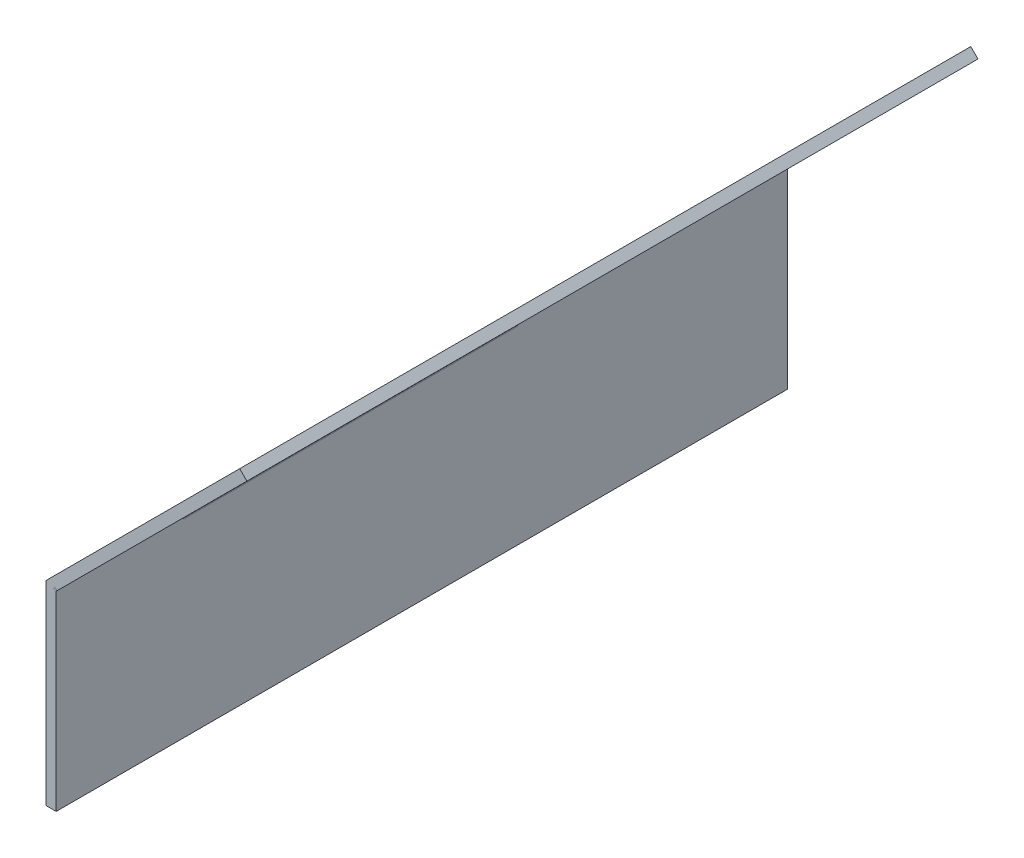
ISO-10303-21;
HEADER;
FILE_DESCRIPTION(('STEP AP214'),'2;1');
FILE_NAME('part.step','',(''),(''),'','','');
FILE_SCHEMA(('AUTOMOTIVE_DESIGN { 1 0 10303 214 1 1 1 1 }'));
ENDSEC;
DATA;
#1=APPLICATION_CONTEXT('core data for automotive mechanical design processes');
#2=APPLICATION_PROTOCOL_DEFINITION('international standard','automotive_design',2000,#1);
#3=PRODUCT_CONTEXT('',#1,'mechanical');
#4=PRODUCT('Part','Part','',(#3));
#5=PRODUCT_RELATED_PRODUCT_CATEGORY('part','',(#4));
#6=PRODUCT_DEFINITION_FORMATION('','',#4);
#7=PRODUCT_DEFINITION_CONTEXT('part definition',#1,'design');
#8=PRODUCT_DEFINITION('design','',#6,#7);
#9=PRODUCT_DEFINITION_SHAPE('','',#8);
#10=(LENGTH_UNIT() NAMED_UNIT(*) SI_UNIT(.MILLI.,.METRE.));
#11=(NAMED_UNIT(*) PLANE_ANGLE_UNIT() SI_UNIT($,.RADIAN.));
#12=(NAMED_UNIT(*) SI_UNIT($,.STERADIAN.) SOLID_ANGLE_UNIT());
#13=UNCERTAINTY_MEASURE_WITH_UNIT(LENGTH_MEASURE(1.E-05),#10,'distance_accuracy_value','');
#14=(GEOMETRIC_REPRESENTATION_CONTEXT(3) GLOBAL_UNCERTAINTY_ASSIGNED_CONTEXT((#13)) GLOBAL_UNIT_ASSIGNED_CONTEXT((#10,
#11,#12)) REPRESENTATION_CONTEXT('',''));
#15=CARTESIAN_POINT('',(0.,0.,0.));
#16=DIRECTION('',(0.,0.,1.));
#17=DIRECTION('',(1.,0.,0.));
#18=AXIS2_PLACEMENT_3D('',#15,#16,#17);
#19=CARTESIAN_POINT('',(5.334,75.6739487757862,-292.1));
#20=DIRECTION('',(0.,0.,-1.));
#21=DIRECTION('',(-1.,0.,0.));
#22=AXIS2_PLACEMENT_3D('',#19,#20,#21);
#23=CYLINDRICAL_SURFACE('',#22,2.48412);
#24=DIRECTION('',(0.,0.,1.));
#25=VECTOR('',#24,1.);
#26=CARTESIAN_POINT('',(3.57746190271889,77.4304868730673,-292.1));
#27=LINE('',#26,#25);
#28=CARTESIAN_POINT('',(3.57746190271889,77.4304868730673,0.));
#29=VERTEX_POINT('',#28);
#30=CARTESIAN_POINT('',(3.57746190271889,77.4304868730673,-254.));
#31=VERTEX_POINT('',#30);
#32=EDGE_CURVE('E159',#29,#31,#27,.F.);
#33=ORIENTED_EDGE('',*,*,#32,.T.);
#34=CARTESIAN_POINT('',(5.334,75.6739487757862,-254.));
#35=DIRECTION('',(0.,0.,-1.));
#36=DIRECTION('',(-1.,0.,0.));
#37=AXIS2_PLACEMENT_3D('',#34,#35,#36);
#38=CIRCLE('',#37,2.48412);
#39=CARTESIAN_POINT('',(3.01788208970269,76.5719743878931,-254.));
#40=VERTEX_POINT('',#39);
#41=EDGE_CURVE('E139',#31,#40,#38,.F.);
#42=ORIENTED_EDGE('',*,*,#41,.T.);
#43=DIRECTION('',(0.,0.,-1.));
#44=VECTOR('',#43,1.);
#45=CARTESIAN_POINT('',(3.01788208970269,76.5719743878931,-292.1));
#46=LINE('',#45,#44);
#47=CARTESIAN_POINT('',(3.01788208970269,76.5719743878931,-184.15));
#48=VERTEX_POINT('',#47);
#49=EDGE_CURVE('E198',#48,#40,#46,.T.);
#50=ORIENTED_EDGE('',*,*,#49,.F.);
#51=CARTESIAN_POINT('',(5.334,75.6739487757862,-184.15));
#52=DIRECTION('',(0.,0.,1.));
#53=DIRECTION('',(1.,0.,0.));
#54=AXIS2_PLACEMENT_3D('',#51,#52,#53);
#55=CIRCLE('',#54,2.48412);
#56=CARTESIAN_POINT('',(2.84988,75.6739487757861,-184.15));
#57=VERTEX_POINT('',#56);
#58=EDGE_CURVE('E257',#57,#48,#55,.F.);
#59=ORIENTED_EDGE('',*,*,#58,.F.);
#60=DIRECTION('',(0.,0.,1.));
#61=VECTOR('',#60,1.);
#62=CARTESIAN_POINT('',(2.84988,75.6739487757861,-292.1));
#63=LINE('',#62,#61);
#64=CARTESIAN_POINT('',(2.84988,75.6739487757862,-50.8));
#65=VERTEX_POINT('',#64);
#66=EDGE_CURVE('E157',#57,#65,#63,.T.);
#67=ORIENTED_EDGE('',*,*,#66,.T.);
#68=CARTESIAN_POINT('',(5.334,75.6739487757862,-50.8));
#69=DIRECTION('',(0.,0.,-1.));
#70=DIRECTION('',(-1.,0.,0.));
#71=AXIS2_PLACEMENT_3D('',#68,#69,#70);
#72=CIRCLE('',#71,2.48412);
#73=CARTESIAN_POINT('',(3.01788208970269,76.5719743878931,-50.8));
#74=VERTEX_POINT('',#73);
#75=EDGE_CURVE('E171',#74,#65,#72,.F.);
#76=ORIENTED_EDGE('',*,*,#75,.F.);
#77=DIRECTION('',(0.,0.,-1.));
#78=VECTOR('',#77,1.);
#79=CARTESIAN_POINT('',(3.01788208970269,76.5719743878931,-292.1));
#80=LINE('',#79,#78);
#81=CARTESIAN_POINT('',(3.01788208970269,76.5719743878931,0.));
#82=VERTEX_POINT('',#81);
#83=EDGE_CURVE('E178',#74,#82,#80,.F.);
#84=ORIENTED_EDGE('',*,*,#83,.T.);
#85=CARTESIAN_POINT('',(5.334,75.6739487757862,0.));
#86=DIRECTION('',(0.,0.,-1.));
#87=DIRECTION('',(-1.,0.,0.));
#88=AXIS2_PLACEMENT_3D('',#85,#86,#87);
#89=CIRCLE('',#88,2.48412);
#90=EDGE_CURVE('E165',#29,#82,#89,.F.);
#91=ORIENTED_EDGE('',*,*,#90,.F.);
#92=EDGE_LOOP('',(#33,#42,#50,#59,#67,#76,#84,#91));
#93=FACE_BOUND('',#92,.T.);
#94=ADVANCED_FACE('F54',(#93),#23,.T.);
#95=CARTESIAN_POINT('',(80.2640000000003,152.4,-292.1));
#96=DIRECTION('',(0.707106781186549,0.707106781186546,0.));
#97=DIRECTION('',(0.,0.,1.));
#98=AXIS2_PLACEMENT_3D('',#95,#96,#97);
#99=PLANE('',#98);
#100=DIRECTION('',(0.,0.,1.));
#101=VECTOR('',#100,1.);
#102=CARTESIAN_POINT('',(80.2640000000003,152.4,-292.1));
#103=LINE('',#102,#101);
#104=CARTESIAN_POINT('',(80.2640000000003,152.4,-254.));
#105=VERTEX_POINT('',#104);
#106=CARTESIAN_POINT('',(80.2640000000003,152.4,0.));
#107=VERTEX_POINT('',#106);
#108=EDGE_CURVE('E151',#105,#107,#103,.T.);
#109=ORIENTED_EDGE('',*,*,#108,.F.);
#110=DIRECTION('',(-0.707106781186546,0.707106781186549,0.));
#111=VECTOR('',#110,1.);
#112=CARTESIAN_POINT('',(80.2640000000003,152.4,-254.));
#113=LINE('',#112,#111);
#114=CARTESIAN_POINT('',(79.4054875148261,153.258512485174,-254.));
#115=VERTEX_POINT('',#114);
#116=EDGE_CURVE('E137',#105,#115,#113,.T.);
#117=ORIENTED_EDGE('',*,*,#116,.T.);
#118=DIRECTION('',(0.,0.,1.));
#119=VECTOR('',#118,1.);
#120=CARTESIAN_POINT('',(79.4054875148261,153.258512485174,-292.1));
#121=LINE('',#120,#119);
#122=CARTESIAN_POINT('',(79.4054875148261,153.258512485174,0.));
#123=VERTEX_POINT('',#122);
#124=EDGE_CURVE('E149',#115,#123,#121,.T.);
#125=ORIENTED_EDGE('',*,*,#124,.T.);
#126=DIRECTION('',(0.707106781186546,-0.707106781186549,0.));
#127=VECTOR('',#126,1.);
#128=CARTESIAN_POINT('',(80.2640000000003,152.4,0.));
#129=LINE('',#128,#127);
#130=EDGE_CURVE('E169',#123,#107,#129,.T.);
#131=ORIENTED_EDGE('',*,*,#130,.T.);
#132=EDGE_LOOP('',(#109,#117,#125,#131));
#133=FACE_BOUND('',#132,.T.);
#134=ADVANCED_FACE('F147',(#133),#99,.T.);
#135=CARTESIAN_POINT('',(4.064,76.2,-292.1));
#136=DIRECTION('',(0.707106781186546,-0.707106781186549,0.));
#137=DIRECTION('',(0.707106781186549,0.707106781186546,0.));
#138=AXIS2_PLACEMENT_3D('',#135,#136,#137);
#139=PLANE('',#138);
#140=DIRECTION('',(0.,0.,1.));
#141=VECTOR('',#140,1.);
#142=CARTESIAN_POINT('',(4.43597438789309,76.5719743878931,-292.1));
#143=LINE('',#142,#141);
#144=CARTESIAN_POINT('',(4.43597438789309,76.5719743878931,-184.15));
#145=VERTEX_POINT('',#144);
#146=CARTESIAN_POINT('',(4.43597438789309,76.5719743878931,-254.));
#147=VERTEX_POINT('',#146);
#148=EDGE_CURVE('E223',#145,#147,#143,.F.);
#149=ORIENTED_EDGE('',*,*,#148,.T.);
#150=DIRECTION('',(0.707106781186549,0.707106781186546,0.));
#151=VECTOR('',#150,1.);
#152=CARTESIAN_POINT('',(4.064,76.2,-254.));
#153=LINE('',#152,#151);
#154=EDGE_CURVE('E68',#147,#105,#153,.T.);
#155=ORIENTED_EDGE('',*,*,#154,.T.);
#156=ORIENTED_EDGE('',*,*,#108,.T.);
#157=DIRECTION('',(0.707106781186549,0.707106781186546,0.));
#158=VECTOR('',#157,1.);
#159=CARTESIAN_POINT('',(4.064,76.2,0.));
#160=LINE('',#159,#158);
#161=CARTESIAN_POINT('',(4.43597438789309,76.5719743878931,0.));
#162=VERTEX_POINT('',#161);
#163=EDGE_CURVE('E217',#162,#107,#160,.T.);
#164=ORIENTED_EDGE('',*,*,#163,.F.);
#165=CARTESIAN_POINT('',(4.43597438789308,76.5719743878931,-50.8));
#166=VERTEX_POINT('',#165);
#167=EDGE_CURVE('E175',#162,#166,#143,.F.);
#168=ORIENTED_EDGE('',*,*,#167,.T.);
#169=EDGE_CURVE('E226',#166,#145,#143,.F.);
#170=ORIENTED_EDGE('',*,*,#169,.T.);
#171=EDGE_LOOP('',(#149,#155,#156,#164,#168,#170));
#172=FACE_BOUND('',#171,.T.);
#173=ADVANCED_FACE('F238',(#172),#139,.T.);
#174=CARTESIAN_POINT('',(3.20548751482579,77.0585124851742,-292.1));
#175=DIRECTION('',(0.707106781186546,-0.707106781186549,0.));
#176=DIRECTION('',(0.707106781186549,0.707106781186546,0.));
#177=AXIS2_PLACEMENT_3D('',#174,#175,#176);
#178=PLANE('',#177);
#179=DIRECTION('',(0.707106781186549,0.707106781186546,0.));
#180=VECTOR('',#179,1.);
#181=CARTESIAN_POINT('',(3.20548751482579,77.0585124851742,-254.));
#182=LINE('',#181,#180);
#183=EDGE_CURVE('E134',#31,#115,#182,.T.);
#184=ORIENTED_EDGE('',*,*,#183,.F.);
#185=ORIENTED_EDGE('',*,*,#32,.F.);
#186=DIRECTION('',(0.707106781186549,0.707106781186546,0.));
#187=VECTOR('',#186,1.);
#188=CARTESIAN_POINT('',(3.20548751482579,77.0585124851742,0.));
#189=LINE('',#188,#187);
#190=EDGE_CURVE('E156',#29,#123,#189,.T.);
#191=ORIENTED_EDGE('',*,*,#190,.T.);
#192=ORIENTED_EDGE('',*,*,#124,.F.);
#193=EDGE_LOOP('',(#184,#185,#191,#192));
#194=FACE_BOUND('',#193,.T.);
#195=ADVANCED_FACE('F154',(#194),#178,.F.);
#196=CARTESIAN_POINT('',(-139.7,76.5719743878931,-292.1));
#197=DIRECTION('',(0.,1.,0.));
#198=DIRECTION('',(0.,0.,1.));
#199=AXIS2_PLACEMENT_3D('',#196,#197,#198);
#200=PLANE('',#199);
#201=DIRECTION('',(-1.,0.,0.));
#202=VECTOR('',#201,1.);
#203=CARTESIAN_POINT('',(-139.7,76.5719743878931,-254.));
#204=LINE('',#203,#202);
#205=EDGE_CURVE('E12',#147,#40,#204,.T.);
#206=ORIENTED_EDGE('',*,*,#205,.F.);
#207=ORIENTED_EDGE('',*,*,#148,.F.);
#208=DIRECTION('',(1.,0.,0.));
#209=VECTOR('',#208,1.);
#210=CARTESIAN_POINT('',(-139.7,76.5719743878931,-184.15));
#211=LINE('',#210,#209);
#212=EDGE_CURVE('E255',#48,#145,#211,.T.);
#213=ORIENTED_EDGE('',*,*,#212,.F.);
#214=ORIENTED_EDGE('',*,*,#49,.T.);
#215=EDGE_LOOP('',(#206,#207,#213,#214));
#216=FACE_BOUND('',#215,.T.);
#217=ADVANCED_FACE('F276',(#216),#200,.F.);
#218=CARTESIAN_POINT('',(5.334,75.6739487757862,0.));
#219=DIRECTION('',(0.,0.,1.));
#220=DIRECTION('',(1.,0.,0.));
#221=AXIS2_PLACEMENT_3D('',#218,#219,#220);
#222=PLANE('',#221);
#223=ORIENTED_EDGE('',*,*,#90,.T.);
#224=DIRECTION('',(1.,0.,0.));
#225=VECTOR('',#224,1.);
#226=CARTESIAN_POINT('',(-139.7,76.5719743878931,0.));
#227=LINE('',#226,#225);
#228=EDGE_CURVE('E201',#82,#162,#227,.T.);
#229=ORIENTED_EDGE('',*,*,#228,.T.);
#230=DIRECTION('',(0.707106781186544,-0.707106781186551,0.));
#231=VECTOR('',#230,1.);
#232=CARTESIAN_POINT('',(4.4359743878931,76.5719743878931,0.));
#233=LINE('',#232,#231);
#234=EDGE_CURVE('E172',#29,#162,#233,.T.);
#235=ORIENTED_EDGE('',*,*,#234,.F.);
#236=EDGE_LOOP('',(#223,#229,#235));
#237=FACE_BOUND('',#236,.T.);
#238=ADVANCED_FACE('F56',(#237),#222,.T.);
#239=CARTESIAN_POINT('',(4.06400000000001,0.,-292.1));
#240=DIRECTION('',(0.,1.,0.));
#241=DIRECTION('',(0.,0.,1.));
#242=AXIS2_PLACEMENT_3D('',#239,#240,#241);
#243=PLANE('',#242);
#244=DIRECTION('',(1.,0.,0.));
#245=VECTOR('',#244,1.);
#246=CARTESIAN_POINT('',(-139.7,0.,-184.15));
#247=LINE('',#246,#245);
#248=CARTESIAN_POINT('',(2.84988000000001,0.,-184.15));
#249=VERTEX_POINT('',#248);
#250=CARTESIAN_POINT('',(4.06400000000001,0.,-184.15));
#251=VERTEX_POINT('',#250);
#252=EDGE_CURVE('E76',#249,#251,#247,.T.);
#253=ORIENTED_EDGE('',*,*,#252,.T.);
#254=DIRECTION('',(0.,0.,1.));
#255=VECTOR('',#254,1.);
#256=CARTESIAN_POINT('',(4.06400000000001,0.,-292.1));
#257=LINE('',#256,#255);
#258=CARTESIAN_POINT('',(4.06400000000001,0.,-50.8));
#259=VERTEX_POINT('',#258);
#260=EDGE_CURVE('E193',#251,#259,#257,.T.);
#261=ORIENTED_EDGE('',*,*,#260,.T.);
#262=DIRECTION('',(1.,0.,0.));
#263=VECTOR('',#262,1.);
#264=CARTESIAN_POINT('',(-139.7,0.,-50.8));
#265=LINE('',#264,#263);
#266=CARTESIAN_POINT('',(2.84988,0.,-50.8));
#267=VERTEX_POINT('',#266);
#268=EDGE_CURVE('E192',#267,#259,#265,.T.);
#269=ORIENTED_EDGE('',*,*,#268,.F.);
#270=DIRECTION('',(0.,0.,1.));
#271=VECTOR('',#270,1.);
#272=CARTESIAN_POINT('',(2.84988000000001,0.,-292.1));
#273=LINE('',#272,#271);
#274=EDGE_CURVE('E161',#249,#267,#273,.T.);
#275=ORIENTED_EDGE('',*,*,#274,.F.);
#276=EDGE_LOOP('',(#253,#261,#269,#275));
#277=FACE_BOUND('',#276,.T.);
#278=ADVANCED_FACE('F189',(#277),#243,.F.);
#279=CARTESIAN_POINT('',(4.064,76.2,0.));
#280=DIRECTION('',(0.,0.,-1.));
#281=DIRECTION('',(0.707106781186549,0.707106781186546,0.));
#282=AXIS2_PLACEMENT_3D('',#279,#280,#281);
#283=PLANE('',#282);
#284=ORIENTED_EDGE('',*,*,#130,.F.);
#285=ORIENTED_EDGE('',*,*,#190,.F.);
#286=ORIENTED_EDGE('',*,*,#234,.T.);
#287=ORIENTED_EDGE('',*,*,#163,.T.);
#288=EDGE_LOOP('',(#284,#285,#286,#287));
#289=FACE_BOUND('',#288,.T.);
#290=ADVANCED_FACE('F234',(#289),#283,.F.);
#291=CARTESIAN_POINT('',(4.06400000000001,0.,-292.1));
#292=DIRECTION('',(1.,0.,0.));
#293=DIRECTION('',(0.,1.,0.));
#294=AXIS2_PLACEMENT_3D('',#291,#292,#293);
#295=PLANE('',#294);
#296=CARTESIAN_POINT('',(4.06400000000001,12.7,-171.45));
#297=DIRECTION('',(1.,0.,0.));
#298=DIRECTION('',(0.,1.,0.));
#299=AXIS2_PLACEMENT_3D('',#296,#297,#298);
#300=CIRCLE('',#299,3.26389999999998);
#301=CARTESIAN_POINT('',(4.06400000000001,15.9639,-171.45));
#302=VERTEX_POINT('',#301);
#303=EDGE_CURVE('E252',#302,#302,#300,.T.);
#304=ORIENTED_EDGE('',*,*,#303,.F.);
#305=EDGE_LOOP('',(#304));
#306=FACE_BOUND('',#305,.T.);
#307=CARTESIAN_POINT('',(4.06400000000001,12.7,-63.5));
#308=DIRECTION('',(1.,0.,0.));
#309=DIRECTION('',(0.,1.,0.));
#310=AXIS2_PLACEMENT_3D('',#307,#308,#309);
#311=CIRCLE('',#310,3.26389999999999);
#312=CARTESIAN_POINT('',(4.06400000000001,15.9639,-63.5));
#313=VERTEX_POINT('',#312);
#314=EDGE_CURVE('E248',#313,#313,#311,.T.);
#315=ORIENTED_EDGE('',*,*,#314,.F.);
#316=EDGE_LOOP('',(#315));
#317=FACE_BOUND('',#316,.T.);
#318=DIRECTION('',(0.,-1.,0.));
#319=VECTOR('',#318,1.);
#320=CARTESIAN_POINT('',(4.06400000000001,0.,-184.15));
#321=LINE('',#320,#319);
#322=CARTESIAN_POINT('',(4.064,75.6739487757862,-184.15));
#323=VERTEX_POINT('',#322);
#324=EDGE_CURVE('E204',#323,#251,#321,.T.);
#325=ORIENTED_EDGE('',*,*,#324,.F.);
#326=DIRECTION('',(0.,0.,1.));
#327=VECTOR('',#326,1.);
#328=CARTESIAN_POINT('',(4.064,75.6739487757862,0.));
#329=LINE('',#328,#327);
#330=CARTESIAN_POINT('',(4.064,75.6739487757862,-50.8));
#331=VERTEX_POINT('',#330);
#332=EDGE_CURVE('E221',#323,#331,#329,.T.);
#333=ORIENTED_EDGE('',*,*,#332,.T.);
#334=DIRECTION('',(0.,1.,0.));
#335=VECTOR('',#334,1.);
#336=CARTESIAN_POINT('',(4.06400000000001,0.,-50.8));
#337=LINE('',#336,#335);
#338=EDGE_CURVE('E168',#259,#331,#337,.T.);
#339=ORIENTED_EDGE('',*,*,#338,.F.);
#340=ORIENTED_EDGE('',*,*,#260,.F.);
#341=EDGE_LOOP('',(#325,#333,#339,#340));
#342=FACE_BOUND('',#341,.T.);
#343=ADVANCED_FACE('F267',(#306,#317,#342),#295,.T.);
#344=CARTESIAN_POINT('',(5.334,75.6739487757862,-292.1));
#345=DIRECTION('',(0.,0.,-1.));
#346=DIRECTION('',(-1.,0.,0.));
#347=AXIS2_PLACEMENT_3D('',#344,#345,#346);
#348=CYLINDRICAL_SURFACE('',#347,1.27);
#349=ORIENTED_EDGE('',*,*,#332,.F.);
#350=CARTESIAN_POINT('',(5.334,75.6739487757862,-184.15));
#351=DIRECTION('',(0.,0.,1.));
#352=DIRECTION('',(1.,0.,0.));
#353=AXIS2_PLACEMENT_3D('',#350,#351,#352);
#354=CIRCLE('',#353,1.27);
#355=EDGE_CURVE('E261',#323,#145,#354,.F.);
#356=ORIENTED_EDGE('',*,*,#355,.T.);
#357=ORIENTED_EDGE('',*,*,#169,.F.);
#358=CARTESIAN_POINT('',(5.334,75.6739487757862,-50.8));
#359=DIRECTION('',(0.,0.,-1.));
#360=DIRECTION('',(-1.,0.,0.));
#361=AXIS2_PLACEMENT_3D('',#358,#359,#360);
#362=CIRCLE('',#361,1.27);
#363=EDGE_CURVE('E212',#166,#331,#362,.F.);
#364=ORIENTED_EDGE('',*,*,#363,.T.);
#365=EDGE_LOOP('',(#349,#356,#357,#364));
#366=FACE_BOUND('',#365,.T.);
#367=ADVANCED_FACE('F269',(#366),#348,.F.);
#368=CARTESIAN_POINT('',(2.84988000000001,0.,-292.1));
#369=DIRECTION('',(1.,0.,0.));
#370=DIRECTION('',(0.,1.,0.));
#371=AXIS2_PLACEMENT_3D('',#368,#369,#370);
#372=PLANE('',#371);
#373=CARTESIAN_POINT('',(2.84988000000001,12.7,-171.45));
#374=DIRECTION('',(-1.,0.,0.));
#375=DIRECTION('',(0.,-1.,0.));
#376=AXIS2_PLACEMENT_3D('',#373,#374,#375);
#377=CIRCLE('',#376,3.26389999999998);
#378=CARTESIAN_POINT('',(2.84988000000001,9.43610000000002,-171.45));
#379=VERTEX_POINT('',#378);
#380=EDGE_CURVE('E243',#379,#379,#377,.T.);
#381=ORIENTED_EDGE('',*,*,#380,.F.);
#382=EDGE_LOOP('',(#381));
#383=FACE_BOUND('',#382,.T.);
#384=CARTESIAN_POINT('',(2.84988000000001,12.7,-63.5));
#385=DIRECTION('',(-1.,0.,0.));
#386=DIRECTION('',(0.,-1.,0.));
#387=AXIS2_PLACEMENT_3D('',#384,#385,#386);
#388=CIRCLE('',#387,3.26389999999999);
#389=CARTESIAN_POINT('',(2.84988000000001,9.43610000000001,-63.5));
#390=VERTEX_POINT('',#389);
#391=EDGE_CURVE('E240',#390,#390,#388,.T.);
#392=ORIENTED_EDGE('',*,*,#391,.F.);
#393=EDGE_LOOP('',(#392));
#394=FACE_BOUND('',#393,.T.);
#395=ORIENTED_EDGE('',*,*,#66,.F.);
#396=DIRECTION('',(0.,-1.,0.));
#397=VECTOR('',#396,1.);
#398=CARTESIAN_POINT('',(2.84988000000001,0.,-184.15));
#399=LINE('',#398,#397);
#400=EDGE_CURVE('E62',#57,#249,#399,.T.);
#401=ORIENTED_EDGE('',*,*,#400,.T.);
#402=ORIENTED_EDGE('',*,*,#274,.T.);
#403=DIRECTION('',(0.,1.,0.));
#404=VECTOR('',#403,1.);
#405=CARTESIAN_POINT('',(2.84988000000001,0.,-50.8));
#406=LINE('',#405,#404);
#407=EDGE_CURVE('E210',#267,#65,#406,.T.);
#408=ORIENTED_EDGE('',*,*,#407,.T.);
#409=EDGE_LOOP('',(#395,#401,#402,#408));
#410=FACE_BOUND('',#409,.T.);
#411=ADVANCED_FACE('F183',(#383,#394,#410),#372,.F.);
#412=CARTESIAN_POINT('',(-139.7,76.5719743878931,0.));
#413=DIRECTION('',(0.,-1.,0.));
#414=DIRECTION('',(0.,0.,-1.));
#415=AXIS2_PLACEMENT_3D('',#412,#413,#414);
#416=PLANE('',#415);
#417=ORIENTED_EDGE('',*,*,#167,.F.);
#418=ORIENTED_EDGE('',*,*,#228,.F.);
#419=ORIENTED_EDGE('',*,*,#83,.F.);
#420=DIRECTION('',(1.,0.,0.));
#421=VECTOR('',#420,1.);
#422=CARTESIAN_POINT('',(-139.7,76.5719743878931,-50.8));
#423=LINE('',#422,#421);
#424=EDGE_CURVE('E197',#74,#166,#423,.T.);
#425=ORIENTED_EDGE('',*,*,#424,.T.);
#426=EDGE_LOOP('',(#417,#418,#419,#425));
#427=FACE_BOUND('',#426,.T.);
#428=ADVANCED_FACE('F273',(#427),#416,.T.);
#429=CARTESIAN_POINT('',(-139.7,0.,-50.8));
#430=DIRECTION('',(0.,0.,-1.));
#431=DIRECTION('',(-1.,0.,0.));
#432=AXIS2_PLACEMENT_3D('',#429,#430,#431);
#433=PLANE('',#432);
#434=ORIENTED_EDGE('',*,*,#338,.T.);
#435=ORIENTED_EDGE('',*,*,#363,.F.);
#436=ORIENTED_EDGE('',*,*,#424,.F.);
#437=ORIENTED_EDGE('',*,*,#75,.T.);
#438=ORIENTED_EDGE('',*,*,#407,.F.);
#439=ORIENTED_EDGE('',*,*,#268,.T.);
#440=EDGE_LOOP('',(#434,#435,#436,#437,#438,#439));
#441=FACE_BOUND('',#440,.T.);
#442=ADVANCED_FACE('F271',(#441),#433,.F.);
#443=CARTESIAN_POINT('',(-139.7,0.,-184.15));
#444=DIRECTION('',(0.,0.,1.));
#445=DIRECTION('',(1.,0.,0.));
#446=AXIS2_PLACEMENT_3D('',#443,#444,#445);
#447=PLANE('',#446);
#448=ORIENTED_EDGE('',*,*,#324,.T.);
#449=ORIENTED_EDGE('',*,*,#252,.F.);
#450=ORIENTED_EDGE('',*,*,#400,.F.);
#451=ORIENTED_EDGE('',*,*,#58,.T.);
#452=ORIENTED_EDGE('',*,*,#212,.T.);
#453=ORIENTED_EDGE('',*,*,#355,.F.);
#454=EDGE_LOOP('',(#448,#449,#450,#451,#452,#453));
#455=FACE_BOUND('',#454,.T.);
#456=ADVANCED_FACE('F264',(#455),#447,.F.);
#457=CARTESIAN_POINT('',(294.94988,12.7,-63.5));
#458=DIRECTION('',(-1.,0.,0.));
#459=DIRECTION('',(0.,-1.,0.));
#460=AXIS2_PLACEMENT_3D('',#457,#458,#459);
#461=CYLINDRICAL_SURFACE('',#460,3.26389999999999);
#462=ORIENTED_EDGE('',*,*,#314,.T.);
#463=EDGE_LOOP('',(#462));
#464=FACE_BOUND('',#463,.T.);
#465=ORIENTED_EDGE('',*,*,#391,.T.);
#466=EDGE_LOOP('',(#465));
#467=FACE_BOUND('',#466,.T.);
#468=ADVANCED_FACE('F341',(#464,#467),#461,.F.);
#469=CARTESIAN_POINT('',(294.94988,12.7,-171.45));
#470=DIRECTION('',(-1.,0.,0.));
#471=DIRECTION('',(0.,-1.,0.));
#472=AXIS2_PLACEMENT_3D('',#469,#470,#471);
#473=CYLINDRICAL_SURFACE('',#472,3.26389999999998);
#474=ORIENTED_EDGE('',*,*,#303,.T.);
#475=EDGE_LOOP('',(#474));
#476=FACE_BOUND('',#475,.T.);
#477=ORIENTED_EDGE('',*,*,#380,.T.);
#478=EDGE_LOOP('',(#477));
#479=FACE_BOUND('',#478,.T.);
#480=ADVANCED_FACE('F346',(#476,#479),#473,.F.);
#481=CARTESIAN_POINT('',(0.,76.5719743878931,-254.));
#482=DIRECTION('',(0.,0.,-1.));
#483=DIRECTION('',(-1.,0.,0.));
#484=AXIS2_PLACEMENT_3D('',#481,#482,#483);
#485=PLANE('',#484);
#486=ORIENTED_EDGE('',*,*,#205,.T.);
#487=ORIENTED_EDGE('',*,*,#41,.F.);
#488=ORIENTED_EDGE('',*,*,#183,.T.);
#489=ORIENTED_EDGE('',*,*,#116,.F.);
#490=ORIENTED_EDGE('',*,*,#154,.F.);
#491=EDGE_LOOP('',(#486,#487,#488,#489,#490));
#492=FACE_BOUND('',#491,.T.);
#493=ADVANCED_FACE('F136',(#492),#485,.T.);
#494=CLOSED_SHELL('',(#94,#134,#173,#195,#217,#238,#278,#290,#343,#367,#411,#428,#442,#456,#468,
#480,#493));
#495=MANIFOLD_SOLID_BREP('B2',#494);
#496=CARTESIAN_POINT('',(0.,77.8833639174843,-292.1));
#497=DIRECTION('',(-1.,0.,0.));
#498=DIRECTION('',(0.,0.,1.));
#499=AXIS2_PLACEMENT_3D('',#496,#497,#498);
#500=PLANE('',#499);
#501=DIRECTION('',(0.,-1.,0.));
#502=VECTOR('',#501,1.);
#503=CARTESIAN_POINT('',(0.,77.8833639174843,0.));
#504=LINE('',#503,#502);
#505=CARTESIAN_POINT('',(0.,77.8833639174843,0.));
#506=VERTEX_POINT('',#505);
#507=CARTESIAN_POINT('',(0.,0.,0.));
#508=VERTEX_POINT('',#507);
#509=EDGE_CURVE('E542',#506,#508,#504,.T.);
#510=ORIENTED_EDGE('',*,*,#509,.F.);
#511=DIRECTION('',(0.,0.,1.));
#512=VECTOR('',#511,1.);
#513=CARTESIAN_POINT('',(0.,77.8833639174843,-292.1));
#514=LINE('',#513,#512);
#515=CARTESIAN_POINT('',(0.,77.8833639174843,-292.1));
#516=VERTEX_POINT('',#515);
#517=EDGE_CURVE('E52',#516,#506,#514,.T.);
#518=ORIENTED_EDGE('',*,*,#517,.F.);
#519=DIRECTION('',(0.,-1.,0.));
#520=VECTOR('',#519,1.);
#521=CARTESIAN_POINT('',(0.,77.8833639174843,-292.1));
#522=LINE('',#521,#520);
#523=CARTESIAN_POINT('',(0.,0.,-292.1));
#524=VERTEX_POINT('',#523);
#525=EDGE_CURVE('E554',#516,#524,#522,.T.);
#526=ORIENTED_EDGE('',*,*,#525,.T.);
#527=DIRECTION('',(0.,0.,1.));
#528=VECTOR('',#527,1.);
#529=CARTESIAN_POINT('',(0.,0.,-292.1));
#530=LINE('',#529,#528);
#531=EDGE_CURVE('E460',#524,#508,#530,.T.);
#532=ORIENTED_EDGE('',*,*,#531,.T.);
#533=EDGE_LOOP('',(#510,#518,#526,#532));
#534=FACE_BOUND('',#533,.T.);
#535=ADVANCED_FACE('F457',(#534),#500,.T.);
#536=CARTESIAN_POINT('',(0.,77.8833639174843,-292.1));
#537=DIRECTION('',(-0.707106781186547,0.707106781186548,0.));
#538=DIRECTION('',(-0.707106781186548,-0.707106781186547,0.));
#539=AXIS2_PLACEMENT_3D('',#536,#537,#538);
#540=PLANE('',#539);
#541=DIRECTION('',(-0.707106781186548,-0.707106781186547,0.));
#542=VECTOR('',#541,1.);
#543=CARTESIAN_POINT('',(0.,77.8833639174843,0.));
#544=LINE('',#543,#542);
#545=CARTESIAN_POINT('',(77.3903180412582,155.273681958742,0.));
#546=VERTEX_POINT('',#545);
#547=EDGE_CURVE('E494',#546,#506,#544,.T.);
#548=ORIENTED_EDGE('',*,*,#547,.F.);
#549=DIRECTION('',(0.,0.,1.));
#550=VECTOR('',#549,1.);
#551=CARTESIAN_POINT('',(77.3903180412582,155.273681958742,-292.1));
#552=LINE('',#551,#550);
#553=CARTESIAN_POINT('',(77.3903180412582,155.273681958742,-292.1));
#554=VERTEX_POINT('',#553);
#555=EDGE_CURVE('E466',#554,#546,#552,.T.);
#556=ORIENTED_EDGE('',*,*,#555,.F.);
#557=DIRECTION('',(-0.707106781187276,-0.707106781185819,0.));
#558=VECTOR('',#557,1.);
#559=CARTESIAN_POINT('',(77.3903180412582,155.273681958742,-292.1));
#560=LINE('',#559,#558);
#561=EDGE_CURVE('E474',#554,#516,#560,.T.);
#562=ORIENTED_EDGE('',*,*,#561,.T.);
#563=ORIENTED_EDGE('',*,*,#517,.T.);
#564=EDGE_LOOP('',(#548,#556,#562,#563));
#565=FACE_BOUND('',#564,.T.);
#566=ADVANCED_FACE('F575',(#565),#540,.T.);
#567=CARTESIAN_POINT('',(80.2640000000003,152.4,-292.1));
#568=DIRECTION('',(0.707106781186551,0.707106781186544,0.));
#569=DIRECTION('',(-0.707106781186544,0.707106781186551,0.));
#570=AXIS2_PLACEMENT_3D('',#567,#568,#569);
#571=PLANE('',#570);
#572=DIRECTION('',(-0.707106781186544,0.707106781186551,0.));
#573=VECTOR('',#572,1.);
#574=CARTESIAN_POINT('',(80.2640000000003,152.4,0.));
#575=LINE('',#574,#573);
#576=CARTESIAN_POINT('',(80.2640000000003,152.4,0.));
#577=VERTEX_POINT('',#576);
#578=EDGE_CURVE('E519',#577,#546,#575,.T.);
#579=ORIENTED_EDGE('',*,*,#578,.F.);
#580=DIRECTION('',(0.,0.,1.));
#581=VECTOR('',#580,1.);
#582=CARTESIAN_POINT('',(80.2640000000003,152.4,-292.1));
#583=LINE('',#582,#581);
#584=CARTESIAN_POINT('',(80.2640000000003,152.4,-292.1));
#585=VERTEX_POINT('',#584);
#586=EDGE_CURVE('E514',#585,#577,#583,.T.);
#587=ORIENTED_EDGE('',*,*,#586,.F.);
#588=DIRECTION('',(-0.707106781186544,0.707106781186551,0.));
#589=VECTOR('',#588,1.);
#590=CARTESIAN_POINT('',(80.2640000000003,152.4,-292.1));
#591=LINE('',#590,#589);
#592=EDGE_CURVE('E517',#585,#554,#591,.T.);
#593=ORIENTED_EDGE('',*,*,#592,.T.);
#594=ORIENTED_EDGE('',*,*,#555,.T.);
#595=EDGE_LOOP('',(#579,#587,#593,#594));
#596=FACE_BOUND('',#595,.T.);
#597=ADVANCED_FACE('F516',(#596),#571,.T.);
#598=CARTESIAN_POINT('',(4.064,76.2,-292.1));
#599=DIRECTION('',(0.707106781186546,-0.707106781186549,0.));
#600=DIRECTION('',(0.707106781186549,0.707106781186546,0.));
#601=AXIS2_PLACEMENT_3D('',#598,#599,#600);
#602=PLANE('',#601);
#603=DIRECTION('',(0.707106781186549,0.707106781186546,0.));
#604=VECTOR('',#603,1.);
#605=CARTESIAN_POINT('',(4.064,76.2,0.));
#606=LINE('',#605,#604);
#607=CARTESIAN_POINT('',(4.064,76.2,0.));
#608=VERTEX_POINT('',#607);
#609=EDGE_CURVE('E551',#608,#577,#606,.T.);
#610=ORIENTED_EDGE('',*,*,#609,.F.);
#611=DIRECTION('',(0.,0.,1.));
#612=VECTOR('',#611,1.);
#613=CARTESIAN_POINT('',(4.064,76.2,-292.1));
#614=LINE('',#613,#612);
#615=CARTESIAN_POINT('',(4.064,76.2,-292.1));
#616=VERTEX_POINT('',#615);
#617=EDGE_CURVE('E524',#616,#608,#614,.T.);
#618=ORIENTED_EDGE('',*,*,#617,.F.);
#619=DIRECTION('',(0.707106781186549,0.707106781186546,0.));
#620=VECTOR('',#619,1.);
#621=CARTESIAN_POINT('',(4.064,76.2,-292.1));
#622=LINE('',#621,#620);
#623=EDGE_CURVE('E531',#616,#585,#622,.T.);
#624=ORIENTED_EDGE('',*,*,#623,.T.);
#625=ORIENTED_EDGE('',*,*,#586,.T.);
#626=EDGE_LOOP('',(#610,#618,#624,#625));
#627=FACE_BOUND('',#626,.T.);
#628=ADVANCED_FACE('F534',(#627),#602,.T.);
#629=CARTESIAN_POINT('',(4.06400000000001,0.,-292.1));
#630=DIRECTION('',(1.,0.,0.));
#631=DIRECTION('',(0.,1.,0.));
#632=AXIS2_PLACEMENT_3D('',#629,#630,#631);
#633=PLANE('',#632);
#634=DIRECTION('',(0.,1.,0.));
#635=VECTOR('',#634,1.);
#636=CARTESIAN_POINT('',(4.06400000000001,0.,0.));
#637=LINE('',#636,#635);
#638=CARTESIAN_POINT('',(4.06400000000001,0.,0.));
#639=VERTEX_POINT('',#638);
#640=EDGE_CURVE('E548',#639,#608,#637,.T.);
#641=ORIENTED_EDGE('',*,*,#640,.F.);
#642=DIRECTION('',(0.,0.,1.));
#643=VECTOR('',#642,1.);
#644=CARTESIAN_POINT('',(4.06400000000001,0.,-292.1));
#645=LINE('',#644,#643);
#646=CARTESIAN_POINT('',(4.06400000000001,0.,-292.1));
#647=VERTEX_POINT('',#646);
#648=EDGE_CURVE('E557',#647,#639,#645,.T.);
#649=ORIENTED_EDGE('',*,*,#648,.F.);
#650=DIRECTION('',(0.,1.,0.));
#651=VECTOR('',#650,1.);
#652=CARTESIAN_POINT('',(4.06400000000001,0.,-292.1));
#653=LINE('',#652,#651);
#654=EDGE_CURVE('E535',#647,#616,#653,.T.);
#655=ORIENTED_EDGE('',*,*,#654,.T.);
#656=ORIENTED_EDGE('',*,*,#617,.T.);
#657=EDGE_LOOP('',(#641,#649,#655,#656));
#658=FACE_BOUND('',#657,.T.);
#659=ADVANCED_FACE('F565',(#658),#633,.T.);
#660=CARTESIAN_POINT('',(0.,0.,-292.1));
#661=DIRECTION('',(0.,-1.,0.));
#662=DIRECTION('',(0.,0.,-1.));
#663=AXIS2_PLACEMENT_3D('',#660,#661,#662);
#664=PLANE('',#663);
#665=DIRECTION('',(1.,0.,0.));
#666=VECTOR('',#665,1.);
#667=CARTESIAN_POINT('',(0.,0.,0.));
#668=LINE('',#667,#666);
#669=EDGE_CURVE('E545',#508,#639,#668,.T.);
#670=ORIENTED_EDGE('',*,*,#669,.F.);
#671=ORIENTED_EDGE('',*,*,#531,.F.);
#672=DIRECTION('',(1.,0.,0.));
#673=VECTOR('',#672,1.);
#674=CARTESIAN_POINT('',(0.,0.,-292.1));
#675=LINE('',#674,#673);
#676=EDGE_CURVE('E537',#524,#647,#675,.T.);
#677=ORIENTED_EDGE('',*,*,#676,.T.);
#678=ORIENTED_EDGE('',*,*,#648,.T.);
#679=EDGE_LOOP('',(#670,#671,#677,#678));
#680=FACE_BOUND('',#679,.T.);
#681=ADVANCED_FACE('F561',(#680),#664,.T.);
#682=CARTESIAN_POINT('',(0.,0.,-292.1));
#683=DIRECTION('',(0.,0.,1.));
#684=DIRECTION('',(1.,0.,0.));
#685=AXIS2_PLACEMENT_3D('',#682,#683,#684);
#686=PLANE('',#685);
#687=ORIENTED_EDGE('',*,*,#525,.F.);
#688=ORIENTED_EDGE('',*,*,#561,.F.);
#689=ORIENTED_EDGE('',*,*,#592,.F.);
#690=ORIENTED_EDGE('',*,*,#623,.F.);
#691=ORIENTED_EDGE('',*,*,#654,.F.);
#692=ORIENTED_EDGE('',*,*,#676,.F.);
#693=EDGE_LOOP('',(#687,#688,#689,#690,#691,#692));
#694=FACE_BOUND('',#693,.T.);
#695=ADVANCED_FACE('F529',(#694),#686,.F.);
#696=CARTESIAN_POINT('',(0.,0.,0.));
#697=DIRECTION('',(0.,0.,1.));
#698=DIRECTION('',(1.,0.,0.));
#699=AXIS2_PLACEMENT_3D('',#696,#697,#698);
#700=PLANE('',#699);
#701=ORIENTED_EDGE('',*,*,#509,.T.);
#702=ORIENTED_EDGE('',*,*,#669,.T.);
#703=ORIENTED_EDGE('',*,*,#640,.T.);
#704=ORIENTED_EDGE('',*,*,#609,.T.);
#705=ORIENTED_EDGE('',*,*,#578,.T.);
#706=ORIENTED_EDGE('',*,*,#547,.T.);
#707=EDGE_LOOP('',(#701,#702,#703,#704,#705,#706));
#708=FACE_BOUND('',#707,.T.);
#709=ADVANCED_FACE('F563',(#708),#700,.T.);
#710=CLOSED_SHELL('',(#535,#566,#597,#628,#659,#681,#695,#709));
#711=MANIFOLD_SOLID_BREP('B6_NOT_SHOWN',#710);
#712=ADVANCED_BREP_SHAPE_REPRESENTATION('',(#18,#495,#711),#14);
#713=SHAPE_DEFINITION_REPRESENTATION(#9,#712);
ENDSEC;
END-ISO-10303-21;
